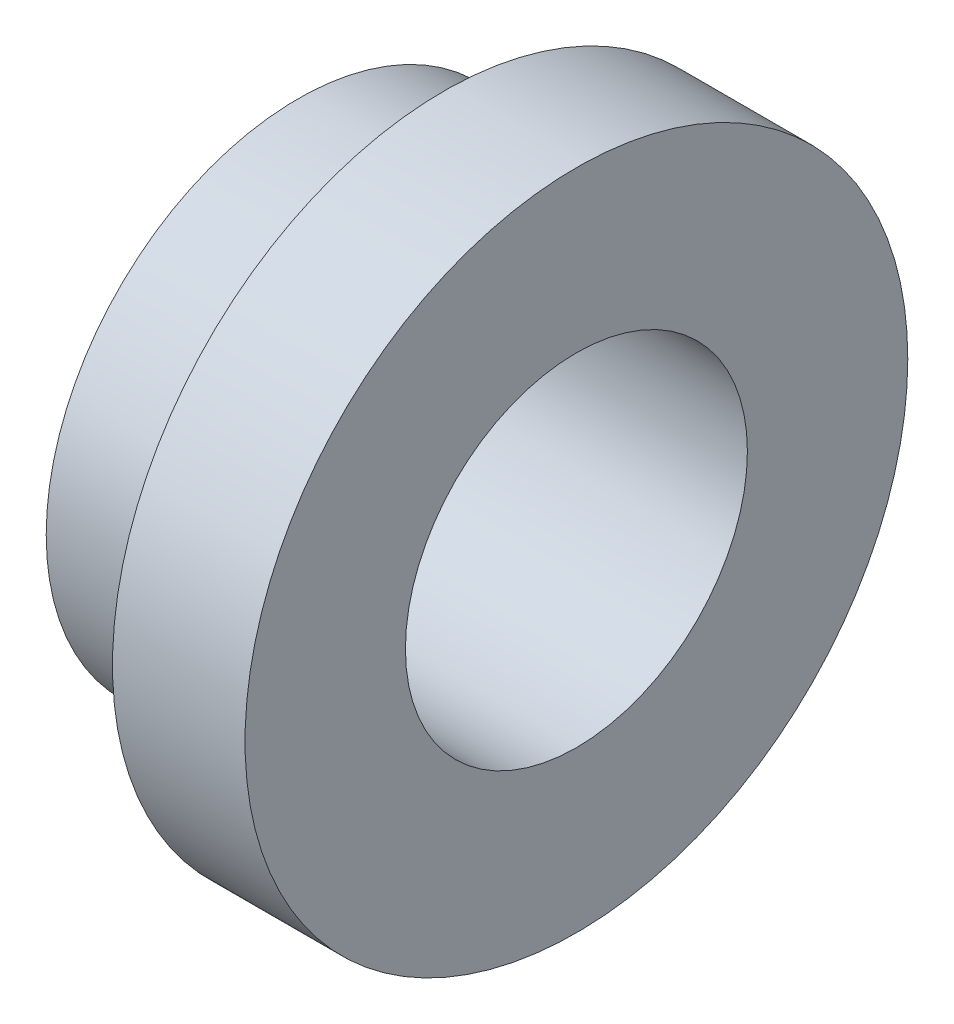
ISO-10303-21;
HEADER;
FILE_DESCRIPTION(('STEP AP214'),'2;1');
FILE_NAME('part.step','',(''),(''),'','','');
FILE_SCHEMA(('AUTOMOTIVE_DESIGN { 1 0 10303 214 1 1 1 1 }'));
ENDSEC;
DATA;
#1=APPLICATION_CONTEXT('core data for automotive mechanical design processes');
#2=APPLICATION_PROTOCOL_DEFINITION('international standard','automotive_design',2000,#1);
#3=PRODUCT_CONTEXT('',#1,'mechanical');
#4=PRODUCT('Part','Part','',(#3));
#5=PRODUCT_RELATED_PRODUCT_CATEGORY('part','',(#4));
#6=PRODUCT_DEFINITION_FORMATION('','',#4);
#7=PRODUCT_DEFINITION_CONTEXT('part definition',#1,'design');
#8=PRODUCT_DEFINITION('design','',#6,#7);
#9=PRODUCT_DEFINITION_SHAPE('','',#8);
#10=(LENGTH_UNIT() NAMED_UNIT(*) SI_UNIT(.MILLI.,.METRE.));
#11=(NAMED_UNIT(*) PLANE_ANGLE_UNIT() SI_UNIT($,.RADIAN.));
#12=(NAMED_UNIT(*) SI_UNIT($,.STERADIAN.) SOLID_ANGLE_UNIT());
#13=UNCERTAINTY_MEASURE_WITH_UNIT(LENGTH_MEASURE(1.E-05),#10,'distance_accuracy_value','');
#14=(GEOMETRIC_REPRESENTATION_CONTEXT(3) GLOBAL_UNCERTAINTY_ASSIGNED_CONTEXT((#13)) GLOBAL_UNIT_ASSIGNED_CONTEXT((#10,
#11,#12)) REPRESENTATION_CONTEXT('',''));
#15=CARTESIAN_POINT('',(0.,0.,0.));
#16=DIRECTION('',(0.,0.,1.));
#17=DIRECTION('',(1.,0.,0.));
#18=AXIS2_PLACEMENT_3D('',#15,#16,#17);
#19=CARTESIAN_POINT('',(5.334,0.,0.));
#20=DIRECTION('',(1.,0.,0.));
#21=DIRECTION('',(0.,0.,1.));
#22=AXIS2_PLACEMENT_3D('',#19,#20,#21);
#23=PLANE('',#22);
#24=CARTESIAN_POINT('',(5.334,0.,0.));
#25=DIRECTION('',(-1.,0.,0.));
#26=DIRECTION('',(0.,0.,1.));
#27=AXIS2_PLACEMENT_3D('',#24,#25,#26);
#28=CIRCLE('',#27,3.2766);
#29=CARTESIAN_POINT('',(5.334,0.,3.2766));
#30=VERTEX_POINT('',#29);
#31=EDGE_CURVE('E56',#30,#30,#28,.T.);
#32=ORIENTED_EDGE('',*,*,#31,.T.);
#33=EDGE_LOOP('',(#32));
#34=FACE_BOUND('',#33,.T.);
#35=CARTESIAN_POINT('',(5.334,0.,0.));
#36=DIRECTION('',(1.,0.,0.));
#37=DIRECTION('',(0.,0.,-1.));
#38=AXIS2_PLACEMENT_3D('',#35,#36,#37);
#39=CIRCLE('',#38,6.35);
#40=CARTESIAN_POINT('',(5.334,0.,-6.35));
#41=VERTEX_POINT('',#40);
#42=EDGE_CURVE('E65',#41,#41,#39,.T.);
#43=ORIENTED_EDGE('',*,*,#42,.T.);
#44=EDGE_LOOP('',(#43));
#45=FACE_BOUND('',#44,.T.);
#46=ADVANCED_FACE('F41',(#34,#45),#23,.T.);
#47=CARTESIAN_POINT('',(0.,0.,0.));
#48=DIRECTION('',(1.,0.,0.));
#49=DIRECTION('',(0.,0.,1.));
#50=AXIS2_PLACEMENT_3D('',#47,#48,#49);
#51=PLANE('',#50);
#52=CARTESIAN_POINT('',(0.,0.,0.));
#53=DIRECTION('',(-1.,0.,0.));
#54=DIRECTION('',(0.,0.,1.));
#55=AXIS2_PLACEMENT_3D('',#52,#53,#54);
#56=CIRCLE('',#55,4.826);
#57=CARTESIAN_POINT('',(0.,0.,4.826));
#58=VERTEX_POINT('',#57);
#59=EDGE_CURVE('E52',#58,#58,#56,.T.);
#60=ORIENTED_EDGE('',*,*,#59,.T.);
#61=EDGE_LOOP('',(#60));
#62=FACE_BOUND('',#61,.T.);
#63=CARTESIAN_POINT('',(0.,0.,0.));
#64=DIRECTION('',(-1.,0.,0.));
#65=DIRECTION('',(0.,0.,1.));
#66=AXIS2_PLACEMENT_3D('',#63,#64,#65);
#67=CIRCLE('',#66,3.2766);
#68=CARTESIAN_POINT('',(0.,0.,3.2766));
#69=VERTEX_POINT('',#68);
#70=EDGE_CURVE('E59',#69,#69,#67,.T.);
#71=ORIENTED_EDGE('',*,*,#70,.F.);
#72=EDGE_LOOP('',(#71));
#73=FACE_BOUND('',#72,.T.);
#74=ADVANCED_FACE('F88',(#62,#73),#51,.F.);
#75=CARTESIAN_POINT('',(5.334,0.,0.));
#76=DIRECTION('',(-1.,0.,0.));
#77=DIRECTION('',(0.,0.,-1.));
#78=AXIS2_PLACEMENT_3D('',#75,#76,#77);
#79=CYLINDRICAL_SURFACE('',#78,4.826);
#80=CARTESIAN_POINT('',(1.905,0.,0.));
#81=DIRECTION('',(1.,0.,0.));
#82=DIRECTION('',(0.,0.,-1.));
#83=AXIS2_PLACEMENT_3D('',#80,#81,#82);
#84=CIRCLE('',#83,4.826);
#85=CARTESIAN_POINT('',(1.905,0.,-4.826));
#86=VERTEX_POINT('',#85);
#87=EDGE_CURVE('E48',#86,#86,#84,.T.);
#88=ORIENTED_EDGE('',*,*,#87,.F.);
#89=EDGE_LOOP('',(#88));
#90=FACE_BOUND('',#89,.T.);
#91=ORIENTED_EDGE('',*,*,#59,.F.);
#92=EDGE_LOOP('',(#91));
#93=FACE_BOUND('',#92,.T.);
#94=ADVANCED_FACE('F84',(#90,#93),#79,.T.);
#95=CARTESIAN_POINT('',(5.334,0.,0.));
#96=DIRECTION('',(-1.,0.,0.));
#97=DIRECTION('',(0.,0.,-1.));
#98=AXIS2_PLACEMENT_3D('',#95,#96,#97);
#99=CYLINDRICAL_SURFACE('',#98,3.2766);
#100=ORIENTED_EDGE('',*,*,#70,.T.);
#101=EDGE_LOOP('',(#100));
#102=FACE_BOUND('',#101,.T.);
#103=ORIENTED_EDGE('',*,*,#31,.F.);
#104=EDGE_LOOP('',(#103));
#105=FACE_BOUND('',#104,.T.);
#106=ADVANCED_FACE('F76',(#102,#105),#99,.F.);
#107=CARTESIAN_POINT('',(2.794,0.,0.));
#108=DIRECTION('',(-1.,0.,0.));
#109=DIRECTION('',(0.,0.,-1.));
#110=AXIS2_PLACEMENT_3D('',#107,#108,#109);
#111=PLANE('',#110);
#112=CARTESIAN_POINT('',(2.794,0.,0.));
#113=DIRECTION('',(1.,0.,0.));
#114=DIRECTION('',(0.,0.,-1.));
#115=AXIS2_PLACEMENT_3D('',#112,#113,#114);
#116=CIRCLE('',#115,5.715);
#117=CARTESIAN_POINT('',(2.794,0.,-5.715));
#118=VERTEX_POINT('',#117);
#119=EDGE_CURVE('E10',#118,#118,#116,.F.);
#120=ORIENTED_EDGE('',*,*,#119,.F.);
#121=EDGE_LOOP('',(#120));
#122=FACE_BOUND('',#121,.T.);
#123=CARTESIAN_POINT('',(2.794,0.,0.));
#124=DIRECTION('',(1.,0.,0.));
#125=DIRECTION('',(0.,0.,-1.));
#126=AXIS2_PLACEMENT_3D('',#123,#124,#125);
#127=CIRCLE('',#126,6.35);
#128=CARTESIAN_POINT('',(2.794,0.,-6.35));
#129=VERTEX_POINT('',#128);
#130=EDGE_CURVE('E62',#129,#129,#127,.T.);
#131=ORIENTED_EDGE('',*,*,#130,.F.);
#132=EDGE_LOOP('',(#131));
#133=FACE_BOUND('',#132,.T.);
#134=ADVANCED_FACE('F74',(#122,#133),#111,.T.);
#135=CARTESIAN_POINT('',(2.794,0.,0.));
#136=DIRECTION('',(1.,0.,0.));
#137=DIRECTION('',(0.,0.,1.));
#138=AXIS2_PLACEMENT_3D('',#135,#136,#137);
#139=CYLINDRICAL_SURFACE('',#138,6.35);
#140=ORIENTED_EDGE('',*,*,#130,.T.);
#141=EDGE_LOOP('',(#140));
#142=FACE_BOUND('',#141,.T.);
#143=ORIENTED_EDGE('',*,*,#42,.F.);
#144=EDGE_LOOP('',(#143));
#145=FACE_BOUND('',#144,.T.);
#146=ADVANCED_FACE('F71',(#142,#145),#139,.T.);
#147=CARTESIAN_POINT('',(1.905,0.,0.));
#148=DIRECTION('',(-1.,0.,0.));
#149=DIRECTION('',(0.,0.,-1.));
#150=AXIS2_PLACEMENT_3D('',#147,#148,#149);
#151=TOROIDAL_SURFACE('',#150,5.715,0.889);
#152=ORIENTED_EDGE('',*,*,#119,.T.);
#153=EDGE_LOOP('',(#152));
#154=FACE_BOUND('',#153,.T.);
#155=ORIENTED_EDGE('',*,*,#87,.T.);
#156=EDGE_LOOP('',(#155));
#157=FACE_BOUND('',#156,.T.);
#158=ADVANCED_FACE('F43',(#154,#157),#151,.F.);
#159=CLOSED_SHELL('',(#46,#74,#94,#106,#134,#146,#158));
#160=MANIFOLD_SOLID_BREP('B2',#159);
#161=ADVANCED_BREP_SHAPE_REPRESENTATION('',(#18,#160),#14);
#162=SHAPE_DEFINITION_REPRESENTATION(#9,#161);
ENDSEC;
END-ISO-10303-21;
